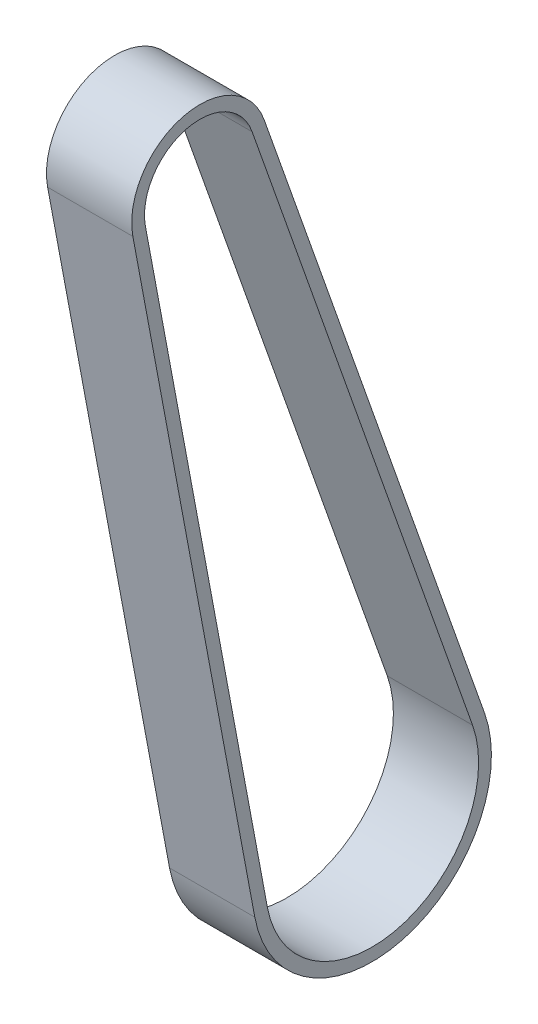
ISO-10303-21;
HEADER;
FILE_DESCRIPTION(('STEP AP214'),'2;1');
FILE_NAME('part.step','',(''),(''),'','','');
FILE_SCHEMA(('AUTOMOTIVE_DESIGN { 1 0 10303 214 1 1 1 1 }'));
ENDSEC;
DATA;
#1=APPLICATION_CONTEXT('core data for automotive mechanical design processes');
#2=APPLICATION_PROTOCOL_DEFINITION('international standard','automotive_design',2000,#1);
#3=PRODUCT_CONTEXT('',#1,'mechanical');
#4=PRODUCT('Part','Part','',(#3));
#5=PRODUCT_RELATED_PRODUCT_CATEGORY('part','',(#4));
#6=PRODUCT_DEFINITION_FORMATION('','',#4);
#7=PRODUCT_DEFINITION_CONTEXT('part definition',#1,'design');
#8=PRODUCT_DEFINITION('design','',#6,#7);
#9=PRODUCT_DEFINITION_SHAPE('','',#8);
#10=(LENGTH_UNIT() NAMED_UNIT(*) SI_UNIT(.MILLI.,.METRE.));
#11=(NAMED_UNIT(*) PLANE_ANGLE_UNIT() SI_UNIT($,.RADIAN.));
#12=(NAMED_UNIT(*) SI_UNIT($,.STERADIAN.) SOLID_ANGLE_UNIT());
#13=UNCERTAINTY_MEASURE_WITH_UNIT(LENGTH_MEASURE(1.E-05),#10,'distance_accuracy_value','');
#14=(GEOMETRIC_REPRESENTATION_CONTEXT(3) GLOBAL_UNCERTAINTY_ASSIGNED_CONTEXT((#13)) GLOBAL_UNIT_ASSIGNED_CONTEXT((#10,
#11,#12)) REPRESENTATION_CONTEXT('',''));
#15=CARTESIAN_POINT('',(0.,0.,0.));
#16=DIRECTION('',(0.,0.,1.));
#17=DIRECTION('',(1.,0.,0.));
#18=AXIS2_PLACEMENT_3D('',#15,#16,#17);
#19=CARTESIAN_POINT('',(377.399587022,122.763731402,-307.443172771));
#20=DIRECTION('',(9.99106447611347E-07,0.333022547465116,-0.942918863359328));
#21=DIRECTION('',(0.,0.942918863359798,0.333022547465282));
#22=AXIS2_PLACEMENT_3D('',#19,#20,#21);
#23=PLANE('',#22);
#24=DIRECTION('',(-0.999999999999439,-1.16827381306051E-10,-1.05963025302046E-06));
#25=VECTOR('',#24,1.);
#26=CARTESIAN_POINT('',(371.89961442949,49.5502932365554,-333.30089195505));
#27=LINE('',#26,#25);
#28=CARTESIAN_POINT('',(366.899614429659,49.5502932359729,-333.300897253031));
#29=VERTEX_POINT('',#28);
#30=CARTESIAN_POINT('',(376.89961443,49.5502932369684,-333.300886656485));
#31=VERTEX_POINT('',#30);
#32=EDGE_CURVE('E90',#29,#31,#27,.F.);
#33=ORIENTED_EDGE('',*,*,#32,.F.);
#34=DIRECTION('',(3.5299092496291E-07,-0.942918863358497,-0.333022547468779));
#35=VECTOR('',#34,1.);
#36=CARTESIAN_POINT('',(366.899587021169,122.763731401,-307.443183897));
#37=LINE('',#36,#35);
#38=CARTESIAN_POINT('',(366.899587021584,122.763731400956,-307.443183897034));
#39=VERTEX_POINT('',#38);
#40=EDGE_CURVE('E117',#39,#29,#37,.T.);
#41=ORIENTED_EDGE('',*,*,#40,.F.);
#42=DIRECTION('',(-0.999999999999439,-1.16827383611051E-10,-1.05963025302046E-06));
#43=VECTOR('',#42,1.);
#44=CARTESIAN_POINT('',(371.899587021852,122.763731401363,-307.443178599001));
#45=LINE('',#44,#43);
#46=CARTESIAN_POINT('',(376.899587021413,122.763731402137,-307.443173300909));
#47=VERTEX_POINT('',#46);
#48=EDGE_CURVE('E93',#47,#39,#45,.T.);
#49=ORIENTED_EDGE('',*,*,#48,.F.);
#50=DIRECTION('',(3.52990924964853E-07,-0.942918863362399,-0.333022547457731));
#51=VECTOR('',#50,1.);
#52=CARTESIAN_POINT('',(376.899587021169,122.763731402,-307.443173301));
#53=LINE('',#52,#51);
#54=EDGE_CURVE('E86',#47,#31,#53,.T.);
#55=ORIENTED_EDGE('',*,*,#54,.T.);
#56=EDGE_LOOP('',(#33,#41,#49,#55));
#57=FACE_BOUND('',#56,.T.);
#58=ADVANCED_FACE('F17',(#57),#23,.T.);
#59=CARTESIAN_POINT('',(371.899600442,44.8879775721,-320.100027868));
#60=DIRECTION('',(-0.999999999999439,-1.16827381306051E-10,-1.05963025302046E-06));
#61=DIRECTION('',(-1.05963025302046E-06,0.,0.999999999999439));
#62=AXIS2_PLACEMENT_3D('',#59,#60,#61);
#63=CYLINDRICAL_SURFACE('',#62,14.);
#64=DIRECTION('',(0.999999999999458,-1.91847451475047E-07,1.0236533698729E-06));
#65=VECTOR('',#64,1.);
#66=CARTESIAN_POINT('',(377.399570697,42.3090749833601,-306.339598301621));
#67=LINE('',#66,#65);
#68=CARTESIAN_POINT('',(376.89958586083,42.3090750789578,-306.339598813757));
#69=VERTEX_POINT('',#68);
#70=CARTESIAN_POINT('',(366.899585861,42.309076037485,-306.339609230056));
#71=VERTEX_POINT('',#70);
#72=EDGE_CURVE('E100',#69,#71,#67,.F.);
#73=ORIENTED_EDGE('',*,*,#72,.T.);
#74=CARTESIAN_POINT('',(366.89960044166,44.8879775715159,-320.100033166151));
#75=DIRECTION('',(-0.999999999999439,-1.16827381306051E-10,-1.05963025302046E-06));
#76=DIRECTION('',(-1.05963025302046E-06,0.,0.999999999999439));
#77=AXIS2_PLACEMENT_3D('',#74,#75,#76);
#78=CIRCLE('',#77,14.);
#79=EDGE_CURVE('E99',#29,#71,#78,.T.);
#80=ORIENTED_EDGE('',*,*,#79,.F.);
#81=ORIENTED_EDGE('',*,*,#32,.T.);
#82=CARTESIAN_POINT('',(376.89960044149,44.8879775726841,-320.100022569849));
#83=DIRECTION('',(-0.999999999999439,-1.16827381306051E-10,-1.05963025302046E-06));
#84=DIRECTION('',(-1.05963025302046E-06,0.,0.999999999999439));
#85=AXIS2_PLACEMENT_3D('',#82,#83,#84);
#86=CIRCLE('',#85,14.);
#87=EDGE_CURVE('E20',#31,#69,#86,.T.);
#88=ORIENTED_EDGE('',*,*,#87,.T.);
#89=EDGE_LOOP('',(#73,#80,#81,#88));
#90=FACE_BOUND('',#89,.T.);
#91=ADVANCED_FACE('F97',(#90),#63,.T.);
#92=CARTESIAN_POINT('',(377.399570697,118.625892454,-292.036722575));
#93=DIRECTION('',(1.04147571565045E-06,0.18420732100808,-0.982887411093428));
#94=DIRECTION('',(0.,0.982887411093961,0.18420732100818));
#95=AXIS2_PLACEMENT_3D('',#92,#93,#94);
#96=PLANE('',#95);
#97=ORIENTED_EDGE('',*,*,#72,.F.);
#98=DIRECTION('',(-1.95306478094497E-07,0.982887411095916,0.184207320997646));
#99=VECTOR('',#98,1.);
#100=CARTESIAN_POINT('',(376.899585861187,42.3090750792,-306.339598813));
#101=LINE('',#100,#99);
#102=CARTESIAN_POINT('',(376.899570696756,118.625892454426,-292.03672310511));
#103=VERTEX_POINT('',#102);
#104=EDGE_CURVE('E87',#69,#103,#101,.T.);
#105=ORIENTED_EDGE('',*,*,#104,.T.);
#106=DIRECTION('',(-0.999999999999439,-1.16827383611051E-10,-1.05963025302046E-06));
#107=VECTOR('',#106,1.);
#108=CARTESIAN_POINT('',(371.899570697194,118.625892453669,-292.036728403302));
#109=LINE('',#108,#107);
#110=CARTESIAN_POINT('',(366.899570696927,118.625892453138,-292.036733701092));
#111=VERTEX_POINT('',#110);
#112=EDGE_CURVE('E102',#111,#103,#109,.F.);
#113=ORIENTED_EDGE('',*,*,#112,.F.);
#114=DIRECTION('',(-1.95306478096011E-07,0.982887411093235,0.184207321011953));
#115=VECTOR('',#114,1.);
#116=CARTESIAN_POINT('',(366.899585861187,42.309075078,-306.33960941));
#117=LINE('',#116,#115);
#118=EDGE_CURVE('E115',#71,#111,#117,.T.);
#119=ORIENTED_EDGE('',*,*,#118,.F.);
#120=EDGE_LOOP('',(#97,#105,#113,#119));
#121=FACE_BOUND('',#120,.T.);
#122=ADVANCED_FACE('F138',(#121),#96,.F.);
#123=CARTESIAN_POINT('',(371.899579029,120.099551022,-299.899827692));
#124=DIRECTION('',(-0.999999999999439,-1.16827383611051E-10,-1.05963025302046E-06));
#125=DIRECTION('',(-1.05963025302046E-06,0.,0.999999999999439));
#126=AXIS2_PLACEMENT_3D('',#123,#124,#125);
#127=CYLINDRICAL_SURFACE('',#126,8.);
#128=ORIENTED_EDGE('',*,*,#48,.T.);
#129=CARTESIAN_POINT('',(366.899579029148,120.099551021416,-299.899832990151));
#130=DIRECTION('',(-0.999999999999439,-1.16827383611051E-10,-1.05963025302046E-06));
#131=DIRECTION('',(-1.05963025302046E-06,0.,0.999999999999439));
#132=AXIS2_PLACEMENT_3D('',#129,#130,#131);
#133=CIRCLE('',#132,8.);
#134=EDGE_CURVE('E112',#111,#39,#133,.T.);
#135=ORIENTED_EDGE('',*,*,#134,.F.);
#136=ORIENTED_EDGE('',*,*,#112,.T.);
#137=CARTESIAN_POINT('',(376.899579028806,120.099551022584,-299.899822393849));
#138=DIRECTION('',(-0.999999999999439,-1.16827383611051E-10,-1.05963025302046E-06));
#139=DIRECTION('',(-1.05963025302046E-06,0.,0.999999999999439));
#140=AXIS2_PLACEMENT_3D('',#137,#138,#139);
#141=CIRCLE('',#140,8.);
#142=EDGE_CURVE('E122',#103,#47,#141,.T.);
#143=ORIENTED_EDGE('',*,*,#142,.T.);
#144=EDGE_LOOP('',(#128,#135,#136,#143));
#145=FACE_BOUND('',#144,.T.);
#146=ADVANCED_FACE('F135',(#145),#127,.T.);
#147=CARTESIAN_POINT('',(377.399585523,122.264197581,-306.028794476));
#148=DIRECTION('',(9.99106447611347E-07,0.333022547465116,-0.942918863359328));
#149=DIRECTION('',(0.,0.942918863359798,0.333022547465282));
#150=AXIS2_PLACEMENT_3D('',#147,#148,#149);
#151=PLANE('',#150);
#152=DIRECTION('',(-0.999999999999439,-1.16827381306051E-10,-1.05963025302046E-06));
#153=VECTOR('',#152,1.);
#154=CARTESIAN_POINT('',(371.899612930831,49.0507594148988,-331.886513660174));
#155=LINE('',#154,#153);
#156=CARTESIAN_POINT('',(366.899612930661,49.0507594145676,-331.886518958053));
#157=VERTEX_POINT('',#156);
#158=CARTESIAN_POINT('',(376.899612930839,49.0507594157861,-331.886508361877));
#159=VERTEX_POINT('',#158);
#160=EDGE_CURVE('E130',#157,#159,#155,.F.);
#161=ORIENTED_EDGE('',*,*,#160,.T.);
#162=DIRECTION('',(-3.52990924954966E-07,0.942918863356596,0.333022547474161));
#163=VECTOR('',#162,1.);
#164=CARTESIAN_POINT('',(376.899612930678,49.0507594154,-331.886508362));
#165=LINE('',#164,#163);
#166=CARTESIAN_POINT('',(376.899585522784,122.264197581584,-306.028795005332));
#167=VERTEX_POINT('',#166);
#168=EDGE_CURVE('E121',#159,#167,#165,.T.);
#169=ORIENTED_EDGE('',*,*,#168,.T.);
#170=DIRECTION('',(-0.999999999999439,-1.16827383611051E-10,-1.05963025302046E-06));
#171=VECTOR('',#170,1.);
#172=CARTESIAN_POINT('',(371.899585523192,122.264197581532,-306.028800303479));
#173=LINE('',#172,#171);
#174=CARTESIAN_POINT('',(366.899585523,122.264197580375,-306.028805601527));
#175=VERTEX_POINT('',#174);
#176=EDGE_CURVE('E95',#167,#175,#173,.T.);
#177=ORIENTED_EDGE('',*,*,#176,.T.);
#178=DIRECTION('',(-3.52990924954109E-07,0.942918863356882,0.333022547473353));
#179=VECTOR('',#178,1.);
#180=CARTESIAN_POINT('',(366.899612930678,49.0507594142,-331.886518958));
#181=LINE('',#180,#179);
#182=EDGE_CURVE('E111',#157,#175,#181,.T.);
#183=ORIENTED_EDGE('',*,*,#182,.F.);
#184=EDGE_LOOP('',(#161,#169,#177,#183));
#185=FACE_BOUND('',#184,.T.);
#186=ADVANCED_FACE('F200',(#185),#151,.F.);
#187=CARTESIAN_POINT('',(371.899579029,120.099551022,-299.899827692));
#188=DIRECTION('',(-0.999999999999439,-1.16827383611051E-10,-1.05963025302046E-06));
#189=DIRECTION('',(-1.05963025302046E-06,0.,0.999999999999439));
#190=AXIS2_PLACEMENT_3D('',#187,#188,#189);
#191=CYLINDRICAL_SURFACE('',#190,6.5);
#192=ORIENTED_EDGE('',*,*,#176,.F.);
#193=CARTESIAN_POINT('',(376.899579028592,120.099551022584,-299.899822393849));
#194=DIRECTION('',(-0.999999999999439,-1.16827383611051E-10,-1.05963025302046E-06));
#195=DIRECTION('',(-1.05963025302046E-06,0.,0.999999999999439));
#196=AXIS2_PLACEMENT_3D('',#193,#194,#195);
#197=CIRCLE('',#196,6.5);
#198=CARTESIAN_POINT('',(376.899572259,118.902202476536,-293.511054401593));
#199=VERTEX_POINT('',#198);
#200=EDGE_CURVE('E120',#167,#199,#197,.F.);
#201=ORIENTED_EDGE('',*,*,#200,.T.);
#202=DIRECTION('',(0.999999999999458,-1.91847451475047E-07,1.0236533698729E-06));
#203=VECTOR('',#202,1.);
#204=CARTESIAN_POINT('',(377.399572259,118.902201420796,-293.511054069678));
#205=LINE('',#204,#203);
#206=CARTESIAN_POINT('',(366.899572259108,118.902203435034,-293.511064818069));
#207=VERTEX_POINT('',#206);
#208=EDGE_CURVE('E107',#207,#199,#205,.T.);
#209=ORIENTED_EDGE('',*,*,#208,.F.);
#210=CARTESIAN_POINT('',(366.899579028808,120.099551021416,-299.899832990151));
#211=DIRECTION('',(-0.999999999999439,-1.16827383611051E-10,-1.05963025302046E-06));
#212=DIRECTION('',(-1.05963025302046E-06,0.,0.999999999999439));
#213=AXIS2_PLACEMENT_3D('',#210,#211,#212);
#214=CIRCLE('',#213,6.5);
#215=EDGE_CURVE('E108',#175,#207,#214,.F.);
#216=ORIENTED_EDGE('',*,*,#215,.F.);
#217=EDGE_LOOP('',(#192,#201,#209,#216));
#218=FACE_BOUND('',#217,.T.);
#219=ADVANCED_FACE('F166',(#218),#191,.F.);
#220=CARTESIAN_POINT('',(376.899261259,4.40321516262E-08,0.000399373859621));
#221=DIRECTION('',(-0.999999999999439,-1.16827384257051E-10,-1.05963025302047E-06));
#222=DIRECTION('',(-1.05963025302047E-06,0.,0.999999999999439));
#223=AXIS2_PLACEMENT_3D('',#220,#221,#222);
#224=PLANE('',#223);
#225=CARTESIAN_POINT('',(376.899600441831,44.8879775726841,-320.100022569849));
#226=DIRECTION('',(-0.999999999999439,-1.16827381306051E-10,-1.05963025302046E-06));
#227=DIRECTION('',(-1.05963025302046E-06,0.,0.999999999999439));
#228=AXIS2_PLACEMENT_3D('',#225,#226,#227);
#229=CIRCLE('',#228,12.5);
#230=CARTESIAN_POINT('',(376.899587423384,42.5853860596798,-307.813929930994));
#231=VERTEX_POINT('',#230);
#232=EDGE_CURVE('E118',#159,#231,#229,.T.);
#233=ORIENTED_EDGE('',*,*,#232,.T.);
#234=DIRECTION('',(1.95297775243785E-07,-0.98288741109398,-0.184207321007977));
#235=VECTOR('',#234,1.);
#236=CARTESIAN_POINT('',(376.899572259,118.902203436146,-293.511054221777));
#237=LINE('',#236,#235);
#238=EDGE_CURVE('E146',#199,#231,#237,.T.);
#239=ORIENTED_EDGE('',*,*,#238,.F.);
#240=ORIENTED_EDGE('',*,*,#200,.F.);
#241=ORIENTED_EDGE('',*,*,#168,.F.);
#242=EDGE_LOOP('',(#233,#239,#240,#241));
#243=FACE_BOUND('',#242,.T.);
#244=ORIENTED_EDGE('',*,*,#104,.F.);
#245=ORIENTED_EDGE('',*,*,#87,.F.);
#246=ORIENTED_EDGE('',*,*,#54,.F.);
#247=ORIENTED_EDGE('',*,*,#142,.F.);
#248=EDGE_LOOP('',(#244,#245,#246,#247));
#249=FACE_BOUND('',#248,.T.);
#250=ADVANCED_FACE('F84',(#243,#249),#224,.F.);
#251=CARTESIAN_POINT('',(371.899600442,44.8879775721,-320.100027868));
#252=DIRECTION('',(-0.999999999999439,-1.16827381306051E-10,-1.05963025302046E-06));
#253=DIRECTION('',(-1.05963025302046E-06,0.,0.999999999999439));
#254=AXIS2_PLACEMENT_3D('',#251,#252,#253);
#255=CYLINDRICAL_SURFACE('',#254,12.5);
#256=DIRECTION('',(0.999999999999458,-1.91847451475047E-07,1.0236533698729E-06));
#257=VECTOR('',#256,1.);
#258=CARTESIAN_POINT('',(377.399572259,42.5853859633557,-307.813929418996));
#259=LINE('',#258,#257);
#260=CARTESIAN_POINT('',(366.899587423,42.5853870179771,-307.813940347479));
#261=VERTEX_POINT('',#260);
#262=EDGE_CURVE('E26',#231,#261,#259,.F.);
#263=ORIENTED_EDGE('',*,*,#262,.F.);
#264=ORIENTED_EDGE('',*,*,#232,.F.);
#265=ORIENTED_EDGE('',*,*,#160,.F.);
#266=CARTESIAN_POINT('',(366.899600441831,44.8879775715159,-320.100033166151));
#267=DIRECTION('',(-0.999999999999439,-1.16827381306051E-10,-1.05963025302046E-06));
#268=DIRECTION('',(-1.05963025302046E-06,0.,0.999999999999439));
#269=AXIS2_PLACEMENT_3D('',#266,#267,#268);
#270=CIRCLE('',#269,12.5);
#271=EDGE_CURVE('E35',#261,#157,#270,.F.);
#272=ORIENTED_EDGE('',*,*,#271,.F.);
#273=EDGE_LOOP('',(#263,#264,#265,#272));
#274=FACE_BOUND('',#273,.T.);
#275=ADVANCED_FACE('F156',(#274),#255,.F.);
#276=CARTESIAN_POINT('',(366.899261259,4.28638777837E-08,0.000388777557091));
#277=DIRECTION('',(-0.999999999999439,-1.16827384257051E-10,-1.05963025302047E-06));
#278=DIRECTION('',(-1.05963025302047E-06,0.,0.999999999999439));
#279=AXIS2_PLACEMENT_3D('',#276,#277,#278);
#280=PLANE('',#279);
#281=DIRECTION('',(-1.95297775244217E-07,0.98288741109398,0.184207321007978));
#282=VECTOR('',#281,1.);
#283=CARTESIAN_POINT('',(366.899587423,42.5853860584945,-307.813940527038));
#284=LINE('',#283,#282);
#285=EDGE_CURVE('E11',#261,#207,#284,.T.);
#286=ORIENTED_EDGE('',*,*,#285,.F.);
#287=ORIENTED_EDGE('',*,*,#271,.T.);
#288=ORIENTED_EDGE('',*,*,#182,.T.);
#289=ORIENTED_EDGE('',*,*,#215,.T.);
#290=EDGE_LOOP('',(#286,#287,#288,#289));
#291=FACE_BOUND('',#290,.T.);
#292=ORIENTED_EDGE('',*,*,#118,.T.);
#293=ORIENTED_EDGE('',*,*,#134,.T.);
#294=ORIENTED_EDGE('',*,*,#40,.T.);
#295=ORIENTED_EDGE('',*,*,#79,.T.);
#296=EDGE_LOOP('',(#292,#293,#294,#295));
#297=FACE_BOUND('',#296,.T.);
#298=ADVANCED_FACE('F141',(#291,#297),#280,.T.);
#299=CARTESIAN_POINT('',(377.399572259,118.902203436,-293.511053692));
#300=DIRECTION('',(1.04147571565045E-06,0.18420732100808,-0.982887411093428));
#301=DIRECTION('',(0.,0.982887411093961,0.18420732100818));
#302=AXIS2_PLACEMENT_3D('',#299,#300,#301);
#303=PLANE('',#302);
#304=ORIENTED_EDGE('',*,*,#262,.T.);
#305=ORIENTED_EDGE('',*,*,#285,.T.);
#306=ORIENTED_EDGE('',*,*,#208,.T.);
#307=ORIENTED_EDGE('',*,*,#238,.T.);
#308=EDGE_LOOP('',(#304,#305,#306,#307));
#309=FACE_BOUND('',#308,.T.);
#310=ADVANCED_FACE('F152',(#309),#303,.T.);
#311=CLOSED_SHELL('',(#58,#91,#122,#146,#186,#219,#250,#275,#298,#310));
#312=MANIFOLD_SOLID_BREP('B1',#311);
#313=ADVANCED_BREP_SHAPE_REPRESENTATION('',(#18,#312),#14);
#314=SHAPE_DEFINITION_REPRESENTATION(#9,#313);
ENDSEC;
END-ISO-10303-21;
